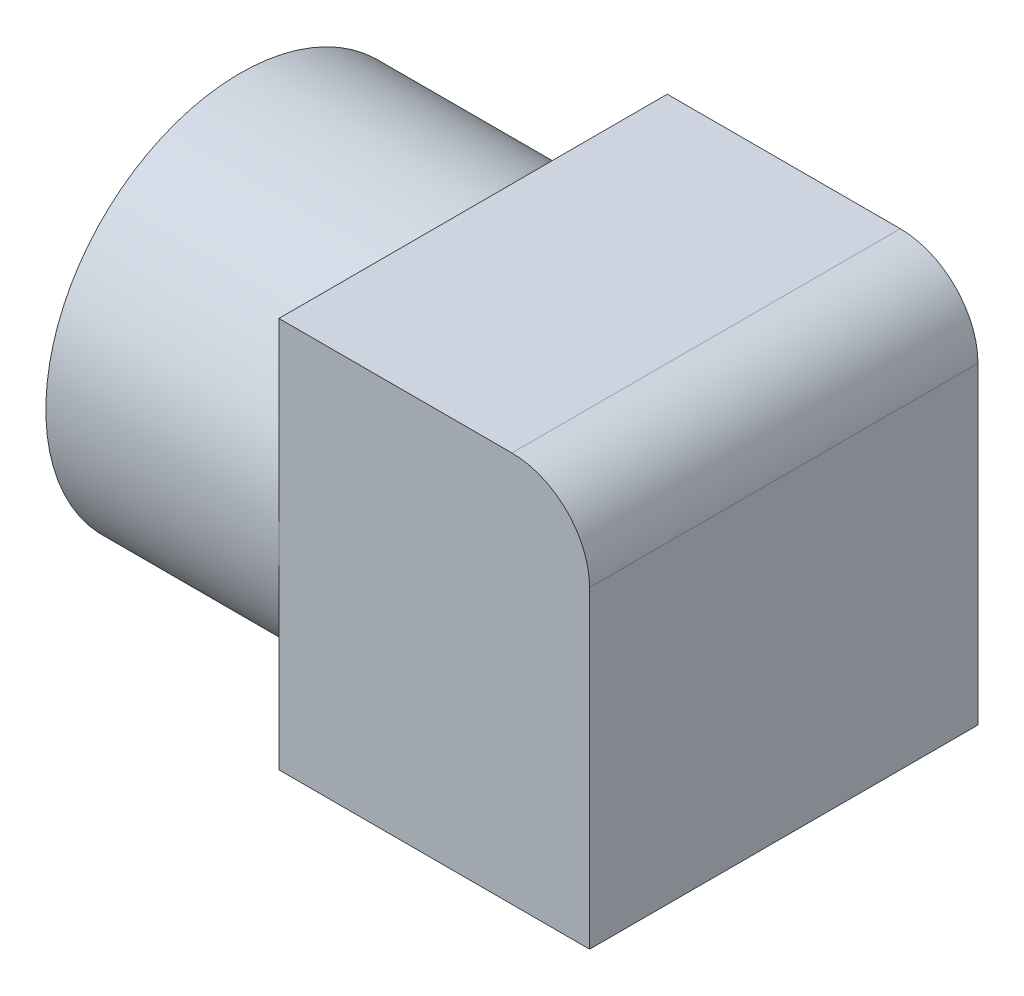
ISO-10303-21;
HEADER;
FILE_DESCRIPTION(('STEP AP214'),'2;1');
FILE_NAME('part.step','',(''),(''),'','','');
FILE_SCHEMA(('AUTOMOTIVE_DESIGN { 1 0 10303 214 1 1 1 1 }'));
ENDSEC;
DATA;
#1=APPLICATION_CONTEXT('core data for automotive mechanical design processes');
#2=APPLICATION_PROTOCOL_DEFINITION('international standard','automotive_design',2000,#1);
#3=PRODUCT_CONTEXT('',#1,'mechanical');
#4=PRODUCT('Part','Part','',(#3));
#5=PRODUCT_RELATED_PRODUCT_CATEGORY('part','',(#4));
#6=PRODUCT_DEFINITION_FORMATION('','',#4);
#7=PRODUCT_DEFINITION_CONTEXT('part definition',#1,'design');
#8=PRODUCT_DEFINITION('design','',#6,#7);
#9=PRODUCT_DEFINITION_SHAPE('','',#8);
#10=(LENGTH_UNIT() NAMED_UNIT(*) SI_UNIT(.MILLI.,.METRE.));
#11=(NAMED_UNIT(*) PLANE_ANGLE_UNIT() SI_UNIT($,.RADIAN.));
#12=(NAMED_UNIT(*) SI_UNIT($,.STERADIAN.) SOLID_ANGLE_UNIT());
#13=UNCERTAINTY_MEASURE_WITH_UNIT(LENGTH_MEASURE(1.E-05),#10,'distance_accuracy_value','');
#14=(GEOMETRIC_REPRESENTATION_CONTEXT(3) GLOBAL_UNCERTAINTY_ASSIGNED_CONTEXT((#13)) GLOBAL_UNIT_ASSIGNED_CONTEXT((#10,
#11,#12)) REPRESENTATION_CONTEXT('',''));
#15=CARTESIAN_POINT('',(0.,0.,0.));
#16=DIRECTION('',(0.,0.,1.));
#17=DIRECTION('',(1.,0.,0.));
#18=AXIS2_PLACEMENT_3D('',#15,#16,#17);
#19=CARTESIAN_POINT('',(30.,0.,0.));
#20=DIRECTION('',(-1.,0.,0.));
#21=DIRECTION('',(0.,0.,1.));
#22=AXIS2_PLACEMENT_3D('',#19,#20,#21);
#23=CYLINDRICAL_SURFACE('',#22,25.);
#24=CARTESIAN_POINT('',(30.,0.,0.));
#25=DIRECTION('',(1.,0.,0.));
#26=DIRECTION('',(0.,0.,-1.));
#27=AXIS2_PLACEMENT_3D('',#24,#25,#26);
#28=CIRCLE('',#27,25.);
#29=CARTESIAN_POINT('',(30.,0.,-25.));
#30=VERTEX_POINT('',#29);
#31=CARTESIAN_POINT('',(30.,0.,25.));
#32=VERTEX_POINT('',#31);
#33=EDGE_CURVE('E127',#30,#32,#28,.T.);
#34=ORIENTED_EDGE('',*,*,#33,.F.);
#35=EDGE_CURVE('E130',#32,#30,#28,.T.);
#36=ORIENTED_EDGE('',*,*,#35,.F.);
#37=EDGE_LOOP('',(#34,#36));
#38=FACE_BOUND('',#37,.T.);
#39=CARTESIAN_POINT('',(0.,0.,0.));
#40=DIRECTION('',(1.,0.,0.));
#41=DIRECTION('',(0.,0.,-1.));
#42=AXIS2_PLACEMENT_3D('',#39,#40,#41);
#43=CIRCLE('',#42,25.);
#44=CARTESIAN_POINT('',(0.,0.,-25.));
#45=VERTEX_POINT('',#44);
#46=EDGE_CURVE('E126',#45,#45,#43,.T.);
#47=ORIENTED_EDGE('',*,*,#46,.T.);
#48=EDGE_LOOP('',(#47));
#49=FACE_BOUND('',#48,.T.);
#50=ADVANCED_FACE('F33',(#38,#49),#23,.T.);
#51=CARTESIAN_POINT('',(0.,0.,0.));
#52=DIRECTION('',(1.,0.,0.));
#53=DIRECTION('',(0.,0.,-1.));
#54=AXIS2_PLACEMENT_3D('',#51,#52,#53);
#55=PLANE('',#54);
#56=ORIENTED_EDGE('',*,*,#46,.F.);
#57=EDGE_LOOP('',(#56));
#58=FACE_BOUND('',#57,.T.);
#59=ADVANCED_FACE('F177',(#58),#55,.F.);
#60=CARTESIAN_POINT('',(30.,0.,0.));
#61=DIRECTION('',(1.,0.,0.));
#62=DIRECTION('',(0.,0.,-1.));
#63=AXIS2_PLACEMENT_3D('',#60,#61,#62);
#64=PLANE('',#63);
#65=DIRECTION('',(0.,1.,0.));
#66=VECTOR('',#65,1.);
#67=CARTESIAN_POINT('',(30.,25.1636818325874,-25.));
#68=LINE('',#67,#66);
#69=CARTESIAN_POINT('',(30.,25.1636818325874,-25.));
#70=VERTEX_POINT('',#69);
#71=EDGE_CURVE('E116',#30,#70,#68,.T.);
#72=ORIENTED_EDGE('',*,*,#71,.F.);
#73=ORIENTED_EDGE('',*,*,#33,.T.);
#74=DIRECTION('',(0.,-1.,0.));
#75=VECTOR('',#74,1.);
#76=CARTESIAN_POINT('',(30.,25.1636818325874,25.));
#77=LINE('',#76,#75);
#78=CARTESIAN_POINT('',(30.,25.1636818325874,25.));
#79=VERTEX_POINT('',#78);
#80=EDGE_CURVE('E119',#79,#32,#77,.T.);
#81=ORIENTED_EDGE('',*,*,#80,.F.);
#82=DIRECTION('',(0.,0.,1.));
#83=VECTOR('',#82,1.);
#84=CARTESIAN_POINT('',(30.,25.1636818325874,25.));
#85=LINE('',#84,#83);
#86=EDGE_CURVE('E115',#70,#79,#85,.T.);
#87=ORIENTED_EDGE('',*,*,#86,.F.);
#88=EDGE_LOOP('',(#72,#73,#81,#87));
#89=FACE_BOUND('',#88,.T.);
#90=ADVANCED_FACE('F145',(#89),#64,.F.);
#91=CARTESIAN_POINT('',(30.,-25.1636818325874,25.));
#92=VERTEX_POINT('',#91);
#93=EDGE_CURVE('E99',#32,#92,#77,.T.);
#94=ORIENTED_EDGE('',*,*,#93,.F.);
#95=ORIENTED_EDGE('',*,*,#35,.T.);
#96=CARTESIAN_POINT('',(30.,-25.1636818325874,-25.));
#97=VERTEX_POINT('',#96);
#98=EDGE_CURVE('E112',#97,#30,#68,.T.);
#99=ORIENTED_EDGE('',*,*,#98,.F.);
#100=DIRECTION('',(0.,0.,-1.));
#101=VECTOR('',#100,1.);
#102=CARTESIAN_POINT('',(30.,-25.1636818325874,25.));
#103=LINE('',#102,#101);
#104=EDGE_CURVE('E121',#92,#97,#103,.T.);
#105=ORIENTED_EDGE('',*,*,#104,.F.);
#106=EDGE_LOOP('',(#94,#95,#99,#105));
#107=FACE_BOUND('',#106,.T.);
#108=ADVANCED_FACE('F140',(#107),#64,.F.);
#109=CARTESIAN_POINT('',(70.,25.1636818325874,-25.));
#110=DIRECTION('',(0.,0.,1.));
#111=DIRECTION('',(0.,-1.,0.));
#112=AXIS2_PLACEMENT_3D('',#109,#110,#111);
#113=PLANE('',#112);
#114=DIRECTION('',(-1.,0.,0.));
#115=VECTOR('',#114,1.);
#116=CARTESIAN_POINT('',(70.,25.1636818325874,-25.));
#117=LINE('',#116,#115);
#118=CARTESIAN_POINT('',(60.,25.1636818325874,-25.));
#119=VERTEX_POINT('',#118);
#120=EDGE_CURVE('E124',#119,#70,#117,.T.);
#121=ORIENTED_EDGE('',*,*,#120,.F.);
#122=CARTESIAN_POINT('',(60.,15.1636818325874,-25.));
#123=DIRECTION('',(0.,0.,1.));
#124=DIRECTION('',(0.,-1.,0.));
#125=AXIS2_PLACEMENT_3D('',#122,#123,#124);
#126=CIRCLE('',#125,10.);
#127=CARTESIAN_POINT('',(70.,15.1636818325874,-25.));
#128=VERTEX_POINT('',#127);
#129=EDGE_CURVE('E11',#119,#128,#126,.F.);
#130=ORIENTED_EDGE('',*,*,#129,.T.);
#131=DIRECTION('',(0.,1.,0.));
#132=VECTOR('',#131,1.);
#133=CARTESIAN_POINT('',(70.,25.1636818325874,-25.));
#134=LINE('',#133,#132);
#135=CARTESIAN_POINT('',(70.,-25.1636818325874,-25.));
#136=VERTEX_POINT('',#135);
#137=EDGE_CURVE('E92',#136,#128,#134,.T.);
#138=ORIENTED_EDGE('',*,*,#137,.F.);
#139=DIRECTION('',(-1.,0.,0.));
#140=VECTOR('',#139,1.);
#141=CARTESIAN_POINT('',(70.,-25.1636818325874,-25.));
#142=LINE('',#141,#140);
#143=EDGE_CURVE('E103',#136,#97,#142,.T.);
#144=ORIENTED_EDGE('',*,*,#143,.T.);
#145=ORIENTED_EDGE('',*,*,#98,.T.);
#146=ORIENTED_EDGE('',*,*,#71,.T.);
#147=EDGE_LOOP('',(#121,#130,#138,#144,#145,#146));
#148=FACE_BOUND('',#147,.T.);
#149=ADVANCED_FACE('F149',(#148),#113,.F.);
#150=CARTESIAN_POINT('',(70.,25.1636818325874,25.));
#151=DIRECTION('',(0.,-1.,0.));
#152=DIRECTION('',(0.,0.,-1.));
#153=AXIS2_PLACEMENT_3D('',#150,#151,#152);
#154=PLANE('',#153);
#155=DIRECTION('',(-1.,0.,0.));
#156=VECTOR('',#155,1.);
#157=CARTESIAN_POINT('',(70.,25.1636818325874,25.));
#158=LINE('',#157,#156);
#159=CARTESIAN_POINT('',(60.,25.1636818325874,25.));
#160=VERTEX_POINT('',#159);
#161=EDGE_CURVE('E102',#160,#79,#158,.T.);
#162=ORIENTED_EDGE('',*,*,#161,.F.);
#163=DIRECTION('',(0.,0.,1.));
#164=VECTOR('',#163,1.);
#165=CARTESIAN_POINT('',(60.,25.1636818325874,-25.));
#166=LINE('',#165,#164);
#167=EDGE_CURVE('E41',#160,#119,#166,.F.);
#168=ORIENTED_EDGE('',*,*,#167,.T.);
#169=ORIENTED_EDGE('',*,*,#120,.T.);
#170=ORIENTED_EDGE('',*,*,#86,.T.);
#171=EDGE_LOOP('',(#162,#168,#169,#170));
#172=FACE_BOUND('',#171,.T.);
#173=ADVANCED_FACE('F173',(#172),#154,.F.);
#174=CARTESIAN_POINT('',(70.,25.1636818325874,25.));
#175=DIRECTION('',(0.,0.,-1.));
#176=DIRECTION('',(0.,1.,0.));
#177=AXIS2_PLACEMENT_3D('',#174,#175,#176);
#178=PLANE('',#177);
#179=DIRECTION('',(0.,-1.,0.));
#180=VECTOR('',#179,1.);
#181=CARTESIAN_POINT('',(70.,25.1636818325874,25.));
#182=LINE('',#181,#180);
#183=CARTESIAN_POINT('',(70.,15.1636818325874,25.));
#184=VERTEX_POINT('',#183);
#185=CARTESIAN_POINT('',(70.,-25.1636818325874,25.));
#186=VERTEX_POINT('',#185);
#187=EDGE_CURVE('E83',#184,#186,#182,.T.);
#188=ORIENTED_EDGE('',*,*,#187,.F.);
#189=CARTESIAN_POINT('',(60.,15.1636818325874,25.));
#190=DIRECTION('',(0.,0.,-1.));
#191=DIRECTION('',(0.,1.,0.));
#192=AXIS2_PLACEMENT_3D('',#189,#190,#191);
#193=CIRCLE('',#192,10.);
#194=EDGE_CURVE('E55',#184,#160,#193,.F.);
#195=ORIENTED_EDGE('',*,*,#194,.T.);
#196=ORIENTED_EDGE('',*,*,#161,.T.);
#197=ORIENTED_EDGE('',*,*,#80,.T.);
#198=ORIENTED_EDGE('',*,*,#93,.T.);
#199=DIRECTION('',(-1.,0.,0.));
#200=VECTOR('',#199,1.);
#201=CARTESIAN_POINT('',(70.,-25.1636818325874,25.));
#202=LINE('',#201,#200);
#203=EDGE_CURVE('E95',#186,#92,#202,.T.);
#204=ORIENTED_EDGE('',*,*,#203,.F.);
#205=EDGE_LOOP('',(#188,#195,#196,#197,#198,#204));
#206=FACE_BOUND('',#205,.T.);
#207=ADVANCED_FACE('F96',(#206),#178,.F.);
#208=CARTESIAN_POINT('',(70.,-25.1636818325874,25.));
#209=DIRECTION('',(0.,1.,0.));
#210=DIRECTION('',(0.,0.,1.));
#211=AXIS2_PLACEMENT_3D('',#208,#209,#210);
#212=PLANE('',#211);
#213=CARTESIAN_POINT('',(50.,-25.1636818325874,0.));
#214=DIRECTION('',(0.,-1.,0.));
#215=DIRECTION('',(0.,0.,-1.));
#216=AXIS2_PLACEMENT_3D('',#213,#214,#215);
#217=CIRCLE('',#216,15.);
#218=CARTESIAN_POINT('',(50.,-25.1636818325874,-15.));
#219=VERTEX_POINT('',#218);
#220=EDGE_CURVE('E152',#219,#219,#217,.T.);
#221=ORIENTED_EDGE('',*,*,#220,.F.);
#222=EDGE_LOOP('',(#221));
#223=FACE_BOUND('',#222,.T.);
#224=ORIENTED_EDGE('',*,*,#104,.T.);
#225=ORIENTED_EDGE('',*,*,#143,.F.);
#226=DIRECTION('',(0.,0.,-1.));
#227=VECTOR('',#226,1.);
#228=CARTESIAN_POINT('',(70.,-25.1636818325874,25.));
#229=LINE('',#228,#227);
#230=EDGE_CURVE('E88',#186,#136,#229,.T.);
#231=ORIENTED_EDGE('',*,*,#230,.F.);
#232=ORIENTED_EDGE('',*,*,#203,.T.);
#233=EDGE_LOOP('',(#224,#225,#231,#232));
#234=FACE_BOUND('',#233,.T.);
#235=ADVANCED_FACE('F105',(#223,#234),#212,.F.);
#236=CARTESIAN_POINT('',(70.,0.,0.));
#237=DIRECTION('',(1.,0.,0.));
#238=DIRECTION('',(0.,0.,-1.));
#239=AXIS2_PLACEMENT_3D('',#236,#237,#238);
#240=PLANE('',#239);
#241=ORIENTED_EDGE('',*,*,#137,.T.);
#242=DIRECTION('',(0.,0.,1.));
#243=VECTOR('',#242,1.);
#244=CARTESIAN_POINT('',(70.,15.1636818325874,25.));
#245=LINE('',#244,#243);
#246=EDGE_CURVE('E91',#128,#184,#245,.T.);
#247=ORIENTED_EDGE('',*,*,#246,.T.);
#248=ORIENTED_EDGE('',*,*,#187,.T.);
#249=ORIENTED_EDGE('',*,*,#230,.T.);
#250=EDGE_LOOP('',(#241,#247,#248,#249));
#251=FACE_BOUND('',#250,.T.);
#252=ADVANCED_FACE('F86',(#251),#240,.T.);
#253=CARTESIAN_POINT('',(60.,15.1636818325874,0.));
#254=DIRECTION('',(0.,0.,-1.));
#255=DIRECTION('',(-1.,0.,0.));
#256=AXIS2_PLACEMENT_3D('',#253,#254,#255);
#257=CYLINDRICAL_SURFACE('',#256,10.);
#258=ORIENTED_EDGE('',*,*,#129,.F.);
#259=ORIENTED_EDGE('',*,*,#167,.F.);
#260=ORIENTED_EDGE('',*,*,#194,.F.);
#261=ORIENTED_EDGE('',*,*,#246,.F.);
#262=EDGE_LOOP('',(#258,#259,#260,#261));
#263=FACE_BOUND('',#262,.T.);
#264=ADVANCED_FACE('F35',(#263),#257,.T.);
#265=CARTESIAN_POINT('',(50.,-15.1636818325874,0.));
#266=DIRECTION('',(0.,-1.,0.));
#267=DIRECTION('',(0.,0.,-1.));
#268=AXIS2_PLACEMENT_3D('',#265,#266,#267);
#269=CYLINDRICAL_SURFACE('',#268,15.);
#270=CARTESIAN_POINT('',(50.,-15.1636818325874,0.));
#271=DIRECTION('',(0.,-1.,0.));
#272=DIRECTION('',(0.,0.,-1.));
#273=AXIS2_PLACEMENT_3D('',#270,#271,#272);
#274=CIRCLE('',#273,15.);
#275=CARTESIAN_POINT('',(50.,-15.1636818325874,-15.));
#276=VERTEX_POINT('',#275);
#277=EDGE_CURVE('E148',#276,#276,#274,.T.);
#278=ORIENTED_EDGE('',*,*,#277,.F.);
#279=EDGE_LOOP('',(#278));
#280=FACE_BOUND('',#279,.T.);
#281=ORIENTED_EDGE('',*,*,#220,.T.);
#282=EDGE_LOOP('',(#281));
#283=FACE_BOUND('',#282,.T.);
#284=ADVANCED_FACE('F160',(#280,#283),#269,.F.);
#285=CARTESIAN_POINT('',(50.,-15.1636818325874,0.));
#286=DIRECTION('',(0.,-1.,0.));
#287=DIRECTION('',(0.,0.,-1.));
#288=AXIS2_PLACEMENT_3D('',#285,#286,#287);
#289=PLANE('',#288);
#290=ORIENTED_EDGE('',*,*,#277,.T.);
#291=EDGE_LOOP('',(#290));
#292=FACE_BOUND('',#291,.T.);
#293=ADVANCED_FACE('F158',(#292),#289,.T.);
#294=CLOSED_SHELL('',(#50,#59,#90,#108,#149,#173,#207,#235,#252,#264,#284,#293));
#295=MANIFOLD_SOLID_BREP('B2',#294);
#296=ADVANCED_BREP_SHAPE_REPRESENTATION('',(#18,#295),#14);
#297=SHAPE_DEFINITION_REPRESENTATION(#9,#296);
ENDSEC;
END-ISO-10303-21;
